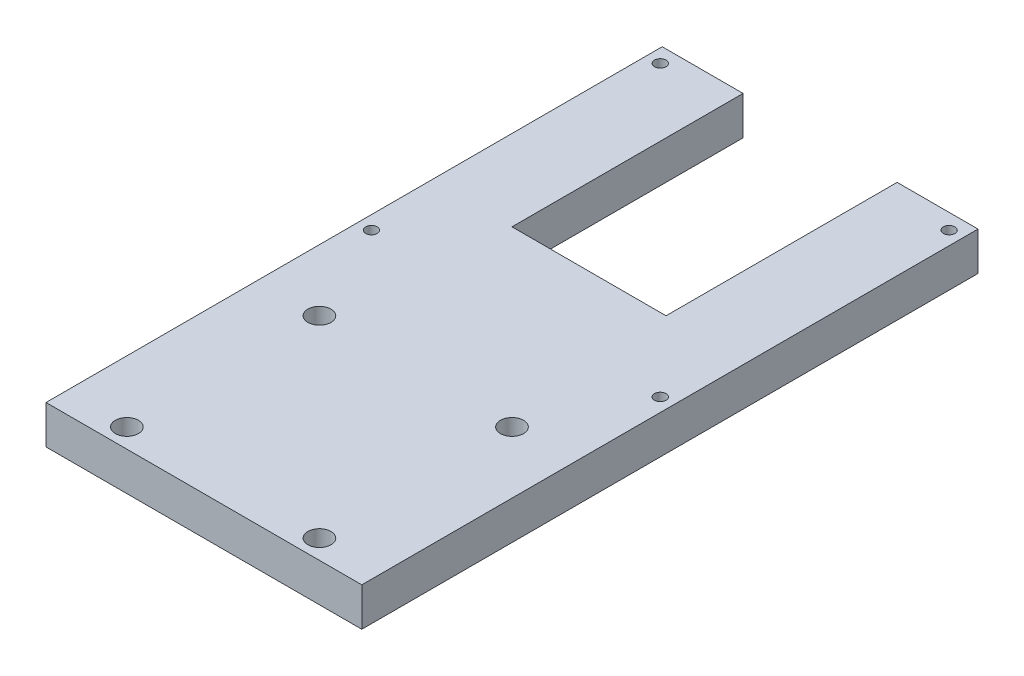
ISO-10303-21;
HEADER;
FILE_DESCRIPTION(('STEP AP214'),'2;1');
FILE_NAME('part.step','',(''),(''),'','','');
FILE_SCHEMA(('AUTOMOTIVE_DESIGN { 1 0 10303 214 1 1 1 1 }'));
ENDSEC;
DATA;
#1=APPLICATION_CONTEXT('core data for automotive mechanical design processes');
#2=APPLICATION_PROTOCOL_DEFINITION('international standard','automotive_design',2000,#1);
#3=PRODUCT_CONTEXT('',#1,'mechanical');
#4=PRODUCT('Part','Part','',(#3));
#5=PRODUCT_RELATED_PRODUCT_CATEGORY('part','',(#4));
#6=PRODUCT_DEFINITION_FORMATION('','',#4);
#7=PRODUCT_DEFINITION_CONTEXT('part definition',#1,'design');
#8=PRODUCT_DEFINITION('design','',#6,#7);
#9=PRODUCT_DEFINITION_SHAPE('','',#8);
#10=(LENGTH_UNIT() NAMED_UNIT(*) SI_UNIT(.MILLI.,.METRE.));
#11=(NAMED_UNIT(*) PLANE_ANGLE_UNIT() SI_UNIT($,.RADIAN.));
#12=(NAMED_UNIT(*) SI_UNIT($,.STERADIAN.) SOLID_ANGLE_UNIT());
#13=UNCERTAINTY_MEASURE_WITH_UNIT(LENGTH_MEASURE(1.E-05),#10,'distance_accuracy_value','');
#14=(GEOMETRIC_REPRESENTATION_CONTEXT(3) GLOBAL_UNCERTAINTY_ASSIGNED_CONTEXT((#13)) GLOBAL_UNIT_ASSIGNED_CONTEXT((#10,
#11,#12)) REPRESENTATION_CONTEXT('',''));
#15=CARTESIAN_POINT('',(0.,0.,0.));
#16=DIRECTION('',(0.,0.,1.));
#17=DIRECTION('',(1.,0.,0.));
#18=AXIS2_PLACEMENT_3D('',#15,#16,#17);
#19=CARTESIAN_POINT('',(0.,10.,0.));
#20=DIRECTION('',(0.,1.,0.));
#21=DIRECTION('',(0.,0.,1.));
#22=AXIS2_PLACEMENT_3D('',#19,#20,#21);
#23=PLANE('',#22);
#24=CARTESIAN_POINT('',(29.4692031234576,10.,-16.2558846313642));
#25=DIRECTION('',(0.,1.,0.));
#26=DIRECTION('',(0.,0.,1.));
#27=AXIS2_PLACEMENT_3D('',#24,#25,#26);
#28=CIRCLE('',#27,1.5);
#29=CARTESIAN_POINT('',(29.4692031234576,10.,-14.7558846313642));
#30=VERTEX_POINT('',#29);
#31=EDGE_CURVE('E253',#30,#30,#28,.T.);
#32=ORIENTED_EDGE('',*,*,#31,.F.);
#33=EDGE_LOOP('',(#32));
#34=FACE_BOUND('',#33,.T.);
#35=CARTESIAN_POINT('',(-45.5307968765432,10.,-91.2558846313642));
#36=DIRECTION('',(0.,1.,0.));
#37=DIRECTION('',(0.,0.,1.));
#38=AXIS2_PLACEMENT_3D('',#35,#36,#37);
#39=CIRCLE('',#38,1.5);
#40=CARTESIAN_POINT('',(-45.5307968765432,10.,-89.7558846313642));
#41=VERTEX_POINT('',#40);
#42=EDGE_CURVE('E237',#41,#41,#39,.T.);
#43=ORIENTED_EDGE('',*,*,#42,.F.);
#44=EDGE_LOOP('',(#43));
#45=FACE_BOUND('',#44,.T.);
#46=CARTESIAN_POINT('',(16.9692031234576,10.,9.7441153686358));
#47=DIRECTION('',(0.,1.,0.));
#48=DIRECTION('',(0.,0.,1.));
#49=AXIS2_PLACEMENT_3D('',#46,#47,#48);
#50=CIRCLE('',#49,3.);
#51=CARTESIAN_POINT('',(16.9692031234576,10.,12.7441153686358));
#52=VERTEX_POINT('',#51);
#53=EDGE_CURVE('E221',#52,#52,#50,.T.);
#54=ORIENTED_EDGE('',*,*,#53,.F.);
#55=EDGE_LOOP('',(#54));
#56=FACE_BOUND('',#55,.T.);
#57=CARTESIAN_POINT('',(-33.0307968765423,10.,59.7441153686358));
#58=DIRECTION('',(0.,1.,0.));
#59=DIRECTION('',(0.,0.,1.));
#60=AXIS2_PLACEMENT_3D('',#57,#58,#59);
#61=CIRCLE('',#60,3.);
#62=CARTESIAN_POINT('',(-33.0307968765423,10.,62.7441153686358));
#63=VERTEX_POINT('',#62);
#64=EDGE_CURVE('E146',#63,#63,#61,.T.);
#65=ORIENTED_EDGE('',*,*,#64,.F.);
#66=EDGE_LOOP('',(#65));
#67=FACE_BOUND('',#66,.T.);
#68=DIRECTION('',(0.,0.,-1.));
#69=VECTOR('',#68,1.);
#70=CARTESIAN_POINT('',(32.9692031234576,10.,64.7441153686358));
#71=LINE('',#70,#69);
#72=CARTESIAN_POINT('',(32.9692031234576,10.,64.7441153686358));
#73=VERTEX_POINT('',#72);
#74=CARTESIAN_POINT('',(32.9692031234576,10.,-95.2558846313642));
#75=VERTEX_POINT('',#74);
#76=EDGE_CURVE('E164',#73,#75,#71,.T.);
#77=ORIENTED_EDGE('',*,*,#76,.T.);
#78=DIRECTION('',(-1.,0.,0.));
#79=VECTOR('',#78,1.);
#80=CARTESIAN_POINT('',(32.9692031234576,10.,-95.2558846313642));
#81=LINE('',#80,#79);
#82=CARTESIAN_POINT('',(11.9692031234576,10.,-95.2558846313642));
#83=VERTEX_POINT('',#82);
#84=EDGE_CURVE('E100',#75,#83,#81,.T.);
#85=ORIENTED_EDGE('',*,*,#84,.T.);
#86=DIRECTION('',(0.,0.,1.));
#87=VECTOR('',#86,1.);
#88=CARTESIAN_POINT('',(11.9692031234576,10.,-95.2558846313642));
#89=LINE('',#88,#87);
#90=CARTESIAN_POINT('',(11.9692031234576,10.,-35.2558846313642));
#91=VERTEX_POINT('',#90);
#92=EDGE_CURVE('E185',#83,#91,#89,.T.);
#93=ORIENTED_EDGE('',*,*,#92,.T.);
#94=DIRECTION('',(-1.,0.,0.));
#95=VECTOR('',#94,1.);
#96=CARTESIAN_POINT('',(-28.0307968765424,10.,-35.2558846313642));
#97=LINE('',#96,#95);
#98=CARTESIAN_POINT('',(-28.0307968765424,10.,-35.2558846313642));
#99=VERTEX_POINT('',#98);
#100=EDGE_CURVE('E199',#91,#99,#97,.T.);
#101=ORIENTED_EDGE('',*,*,#100,.T.);
#102=DIRECTION('',(0.,0.,-1.));
#103=VECTOR('',#102,1.);
#104=CARTESIAN_POINT('',(-28.0307968765424,10.,-95.2558846313642));
#105=LINE('',#104,#103);
#106=CARTESIAN_POINT('',(-28.0307968765424,10.,-95.2558846313642));
#107=VERTEX_POINT('',#106);
#108=EDGE_CURVE('E119',#99,#107,#105,.T.);
#109=ORIENTED_EDGE('',*,*,#108,.T.);
#110=DIRECTION('',(-1.,0.,0.));
#111=VECTOR('',#110,1.);
#112=CARTESIAN_POINT('',(-28.0307968765424,10.,-95.2558846313642));
#113=LINE('',#112,#111);
#114=CARTESIAN_POINT('',(-49.0307968765424,10.,-95.2558846313642));
#115=VERTEX_POINT('',#114);
#116=EDGE_CURVE('E113',#107,#115,#113,.T.);
#117=ORIENTED_EDGE('',*,*,#116,.T.);
#118=DIRECTION('',(0.,0.,1.));
#119=VECTOR('',#118,1.);
#120=CARTESIAN_POINT('',(-49.0307968765424,10.,64.7441153686358));
#121=LINE('',#120,#119);
#122=CARTESIAN_POINT('',(-49.0307968765424,10.,64.7441153686358));
#123=VERTEX_POINT('',#122);
#124=EDGE_CURVE('E117',#115,#123,#121,.T.);
#125=ORIENTED_EDGE('',*,*,#124,.T.);
#126=DIRECTION('',(1.,0.,0.));
#127=VECTOR('',#126,1.);
#128=CARTESIAN_POINT('',(32.9692031234576,10.,64.7441153686358));
#129=LINE('',#128,#127);
#130=EDGE_CURVE('E57',#123,#73,#129,.T.);
#131=ORIENTED_EDGE('',*,*,#130,.T.);
#132=EDGE_LOOP('',(#77,#85,#93,#101,#109,#117,#125,#131));
#133=FACE_BOUND('',#132,.T.);
#134=CARTESIAN_POINT('',(16.9692031234577,10.,59.7441153686358));
#135=DIRECTION('',(0.,1.,0.));
#136=DIRECTION('',(0.,0.,1.));
#137=AXIS2_PLACEMENT_3D('',#134,#135,#136);
#138=CIRCLE('',#137,3.);
#139=CARTESIAN_POINT('',(16.9692031234577,10.,62.7441153686358));
#140=VERTEX_POINT('',#139);
#141=EDGE_CURVE('E213',#140,#140,#138,.T.);
#142=ORIENTED_EDGE('',*,*,#141,.F.);
#143=EDGE_LOOP('',(#142));
#144=FACE_BOUND('',#143,.T.);
#145=CARTESIAN_POINT('',(-33.0307968765424,10.,9.7441153686358));
#146=DIRECTION('',(0.,1.,0.));
#147=DIRECTION('',(0.,0.,1.));
#148=AXIS2_PLACEMENT_3D('',#145,#146,#147);
#149=CIRCLE('',#148,3.);
#150=CARTESIAN_POINT('',(-33.0307968765424,10.,12.7441153686358));
#151=VERTEX_POINT('',#150);
#152=EDGE_CURVE('E229',#151,#151,#149,.T.);
#153=ORIENTED_EDGE('',*,*,#152,.F.);
#154=EDGE_LOOP('',(#153));
#155=FACE_BOUND('',#154,.T.);
#156=CARTESIAN_POINT('',(29.4692031234568,10.,-91.2558846313642));
#157=DIRECTION('',(0.,1.,0.));
#158=DIRECTION('',(0.,0.,1.));
#159=AXIS2_PLACEMENT_3D('',#156,#157,#158);
#160=CIRCLE('',#159,1.5);
#161=CARTESIAN_POINT('',(29.4692031234568,10.,-89.7558846313642));
#162=VERTEX_POINT('',#161);
#163=EDGE_CURVE('E245',#162,#162,#160,.T.);
#164=ORIENTED_EDGE('',*,*,#163,.F.);
#165=EDGE_LOOP('',(#164));
#166=FACE_BOUND('',#165,.T.);
#167=CARTESIAN_POINT('',(-45.5307968765424,10.,-16.2558846313642));
#168=DIRECTION('',(0.,1.,0.));
#169=DIRECTION('',(0.,0.,1.));
#170=AXIS2_PLACEMENT_3D('',#167,#168,#169);
#171=CIRCLE('',#170,1.5);
#172=CARTESIAN_POINT('',(-45.5307968765424,10.,-14.7558846313642));
#173=VERTEX_POINT('',#172);
#174=EDGE_CURVE('E261',#173,#173,#171,.T.);
#175=ORIENTED_EDGE('',*,*,#174,.F.);
#176=EDGE_LOOP('',(#175));
#177=FACE_BOUND('',#176,.T.);
#178=ADVANCED_FACE('F39',(#34,#45,#56,#67,#133,#144,#155,#166,#177),#23,.T.);
#179=CARTESIAN_POINT('',(0.,0.,0.));
#180=DIRECTION('',(0.,1.,0.));
#181=DIRECTION('',(0.,0.,1.));
#182=AXIS2_PLACEMENT_3D('',#179,#180,#181);
#183=PLANE('',#182);
#184=DIRECTION('',(0.,0.,-1.));
#185=VECTOR('',#184,1.);
#186=CARTESIAN_POINT('',(32.9692031234576,0.,64.7441153686358));
#187=LINE('',#186,#185);
#188=CARTESIAN_POINT('',(32.9692031234576,0.,64.7441153686358));
#189=VERTEX_POINT('',#188);
#190=CARTESIAN_POINT('',(32.9692031234576,0.,-95.2558846313642));
#191=VERTEX_POINT('',#190);
#192=EDGE_CURVE('E141',#189,#191,#187,.T.);
#193=ORIENTED_EDGE('',*,*,#192,.F.);
#194=DIRECTION('',(1.,0.,0.));
#195=VECTOR('',#194,1.);
#196=CARTESIAN_POINT('',(32.9692031234576,0.,64.7441153686358));
#197=LINE('',#196,#195);
#198=CARTESIAN_POINT('',(-49.0307968765424,0.,64.7441153686358));
#199=VERTEX_POINT('',#198);
#200=EDGE_CURVE('E92',#199,#189,#197,.T.);
#201=ORIENTED_EDGE('',*,*,#200,.F.);
#202=DIRECTION('',(0.,0.,1.));
#203=VECTOR('',#202,1.);
#204=CARTESIAN_POINT('',(-49.0307968765424,0.,64.7441153686358));
#205=LINE('',#204,#203);
#206=CARTESIAN_POINT('',(-49.0307968765424,0.,-95.2558846313642));
#207=VERTEX_POINT('',#206);
#208=EDGE_CURVE('E86',#207,#199,#205,.T.);
#209=ORIENTED_EDGE('',*,*,#208,.F.);
#210=DIRECTION('',(-1.,0.,0.));
#211=VECTOR('',#210,1.);
#212=CARTESIAN_POINT('',(-28.0307968765424,0.,-95.2558846313642));
#213=LINE('',#212,#211);
#214=CARTESIAN_POINT('',(-28.0307968765424,0.,-95.2558846313642));
#215=VERTEX_POINT('',#214);
#216=EDGE_CURVE('E128',#215,#207,#213,.T.);
#217=ORIENTED_EDGE('',*,*,#216,.F.);
#218=DIRECTION('',(0.,0.,-1.));
#219=VECTOR('',#218,1.);
#220=CARTESIAN_POINT('',(-28.0307968765424,0.,-95.2558846313642));
#221=LINE('',#220,#219);
#222=CARTESIAN_POINT('',(-28.0307968765424,0.,-35.2558846313642));
#223=VERTEX_POINT('',#222);
#224=EDGE_CURVE('E155',#223,#215,#221,.T.);
#225=ORIENTED_EDGE('',*,*,#224,.F.);
#226=DIRECTION('',(-1.,0.,0.));
#227=VECTOR('',#226,1.);
#228=CARTESIAN_POINT('',(-28.0307968765424,0.,-35.2558846313642));
#229=LINE('',#228,#227);
#230=CARTESIAN_POINT('',(11.9692031234576,0.,-35.2558846313642));
#231=VERTEX_POINT('',#230);
#232=EDGE_CURVE('E152',#231,#223,#229,.T.);
#233=ORIENTED_EDGE('',*,*,#232,.F.);
#234=DIRECTION('',(0.,0.,1.));
#235=VECTOR('',#234,1.);
#236=CARTESIAN_POINT('',(11.9692031234576,0.,-95.2558846313642));
#237=LINE('',#236,#235);
#238=CARTESIAN_POINT('',(11.9692031234576,0.,-95.2558846313642));
#239=VERTEX_POINT('',#238);
#240=EDGE_CURVE('E149',#239,#231,#237,.T.);
#241=ORIENTED_EDGE('',*,*,#240,.F.);
#242=DIRECTION('',(-1.,0.,0.));
#243=VECTOR('',#242,1.);
#244=CARTESIAN_POINT('',(32.9692031234576,0.,-95.2558846313642));
#245=LINE('',#244,#243);
#246=EDGE_CURVE('E145',#191,#239,#245,.T.);
#247=ORIENTED_EDGE('',*,*,#246,.F.);
#248=EDGE_LOOP('',(#193,#201,#209,#217,#225,#233,#241,#247));
#249=FACE_BOUND('',#248,.T.);
#250=CARTESIAN_POINT('',(-33.0307968765423,0.,59.7441153686358));
#251=DIRECTION('',(0.,1.,0.));
#252=DIRECTION('',(0.,0.,1.));
#253=AXIS2_PLACEMENT_3D('',#250,#251,#252);
#254=CIRCLE('',#253,3.);
#255=CARTESIAN_POINT('',(-33.0307968765423,0.,62.7441153686358));
#256=VERTEX_POINT('',#255);
#257=EDGE_CURVE('E209',#256,#256,#254,.T.);
#258=ORIENTED_EDGE('',*,*,#257,.T.);
#259=EDGE_LOOP('',(#258));
#260=FACE_BOUND('',#259,.T.);
#261=CARTESIAN_POINT('',(16.9692031234577,0.,59.7441153686358));
#262=DIRECTION('',(0.,1.,0.));
#263=DIRECTION('',(0.,0.,1.));
#264=AXIS2_PLACEMENT_3D('',#261,#262,#263);
#265=CIRCLE('',#264,3.);
#266=CARTESIAN_POINT('',(16.9692031234577,0.,62.7441153686358));
#267=VERTEX_POINT('',#266);
#268=EDGE_CURVE('E217',#267,#267,#265,.T.);
#269=ORIENTED_EDGE('',*,*,#268,.T.);
#270=EDGE_LOOP('',(#269));
#271=FACE_BOUND('',#270,.T.);
#272=CARTESIAN_POINT('',(16.9692031234576,0.,9.7441153686358));
#273=DIRECTION('',(0.,1.,0.));
#274=DIRECTION('',(0.,0.,1.));
#275=AXIS2_PLACEMENT_3D('',#272,#273,#274);
#276=CIRCLE('',#275,3.);
#277=CARTESIAN_POINT('',(16.9692031234576,0.,12.7441153686358));
#278=VERTEX_POINT('',#277);
#279=EDGE_CURVE('E225',#278,#278,#276,.T.);
#280=ORIENTED_EDGE('',*,*,#279,.T.);
#281=EDGE_LOOP('',(#280));
#282=FACE_BOUND('',#281,.T.);
#283=CARTESIAN_POINT('',(-33.0307968765424,0.,9.7441153686358));
#284=DIRECTION('',(0.,1.,0.));
#285=DIRECTION('',(0.,0.,1.));
#286=AXIS2_PLACEMENT_3D('',#283,#284,#285);
#287=CIRCLE('',#286,3.);
#288=CARTESIAN_POINT('',(-33.0307968765424,0.,12.7441153686358));
#289=VERTEX_POINT('',#288);
#290=EDGE_CURVE('E233',#289,#289,#287,.T.);
#291=ORIENTED_EDGE('',*,*,#290,.T.);
#292=EDGE_LOOP('',(#291));
#293=FACE_BOUND('',#292,.T.);
#294=CARTESIAN_POINT('',(-45.5307968765432,0.,-91.2558846313642));
#295=DIRECTION('',(0.,1.,0.));
#296=DIRECTION('',(0.,0.,1.));
#297=AXIS2_PLACEMENT_3D('',#294,#295,#296);
#298=CIRCLE('',#297,1.5);
#299=CARTESIAN_POINT('',(-45.5307968765432,0.,-89.7558846313642));
#300=VERTEX_POINT('',#299);
#301=EDGE_CURVE('E241',#300,#300,#298,.T.);
#302=ORIENTED_EDGE('',*,*,#301,.T.);
#303=EDGE_LOOP('',(#302));
#304=FACE_BOUND('',#303,.T.);
#305=CARTESIAN_POINT('',(29.4692031234568,0.,-91.2558846313642));
#306=DIRECTION('',(0.,1.,0.));
#307=DIRECTION('',(0.,0.,1.));
#308=AXIS2_PLACEMENT_3D('',#305,#306,#307);
#309=CIRCLE('',#308,1.5);
#310=CARTESIAN_POINT('',(29.4692031234568,0.,-89.7558846313642));
#311=VERTEX_POINT('',#310);
#312=EDGE_CURVE('E249',#311,#311,#309,.T.);
#313=ORIENTED_EDGE('',*,*,#312,.T.);
#314=EDGE_LOOP('',(#313));
#315=FACE_BOUND('',#314,.T.);
#316=CARTESIAN_POINT('',(29.4692031234576,0.,-16.2558846313642));
#317=DIRECTION('',(0.,1.,0.));
#318=DIRECTION('',(0.,0.,1.));
#319=AXIS2_PLACEMENT_3D('',#316,#317,#318);
#320=CIRCLE('',#319,1.5);
#321=CARTESIAN_POINT('',(29.4692031234576,0.,-14.7558846313642));
#322=VERTEX_POINT('',#321);
#323=EDGE_CURVE('E257',#322,#322,#320,.T.);
#324=ORIENTED_EDGE('',*,*,#323,.T.);
#325=EDGE_LOOP('',(#324));
#326=FACE_BOUND('',#325,.T.);
#327=CARTESIAN_POINT('',(-45.5307968765424,0.,-16.2558846313642));
#328=DIRECTION('',(0.,1.,0.));
#329=DIRECTION('',(0.,0.,1.));
#330=AXIS2_PLACEMENT_3D('',#327,#328,#329);
#331=CIRCLE('',#330,1.5);
#332=CARTESIAN_POINT('',(-45.5307968765424,0.,-14.7558846313642));
#333=VERTEX_POINT('',#332);
#334=EDGE_CURVE('E265',#333,#333,#331,.T.);
#335=ORIENTED_EDGE('',*,*,#334,.T.);
#336=EDGE_LOOP('',(#335));
#337=FACE_BOUND('',#336,.T.);
#338=ADVANCED_FACE('F189',(#249,#260,#271,#282,#293,#304,#315,#326,#337),#183,.F.);
#339=CARTESIAN_POINT('',(32.9692031234576,10.,64.7441153686358));
#340=DIRECTION('',(-1.,0.,0.));
#341=DIRECTION('',(0.,0.,1.));
#342=AXIS2_PLACEMENT_3D('',#339,#340,#341);
#343=PLANE('',#342);
#344=ORIENTED_EDGE('',*,*,#192,.T.);
#345=DIRECTION('',(0.,-1.,0.));
#346=VECTOR('',#345,1.);
#347=CARTESIAN_POINT('',(32.9692031234576,10.,-95.2558846313642));
#348=LINE('',#347,#346);
#349=EDGE_CURVE('E11',#75,#191,#348,.T.);
#350=ORIENTED_EDGE('',*,*,#349,.F.);
#351=ORIENTED_EDGE('',*,*,#76,.F.);
#352=DIRECTION('',(0.,-1.,0.));
#353=VECTOR('',#352,1.);
#354=CARTESIAN_POINT('',(32.9692031234576,10.,64.7441153686358));
#355=LINE('',#354,#353);
#356=EDGE_CURVE('E137',#73,#189,#355,.T.);
#357=ORIENTED_EDGE('',*,*,#356,.T.);
#358=EDGE_LOOP('',(#344,#350,#351,#357));
#359=FACE_BOUND('',#358,.T.);
#360=ADVANCED_FACE('F41',(#359),#343,.F.);
#361=CARTESIAN_POINT('',(32.9692031234576,10.,-95.2558846313642));
#362=DIRECTION('',(0.,0.,1.));
#363=DIRECTION('',(1.,0.,0.));
#364=AXIS2_PLACEMENT_3D('',#361,#362,#363);
#365=PLANE('',#364);
#366=ORIENTED_EDGE('',*,*,#246,.T.);
#367=DIRECTION('',(0.,-1.,0.));
#368=VECTOR('',#367,1.);
#369=CARTESIAN_POINT('',(11.9692031234576,10.,-95.2558846313642));
#370=LINE('',#369,#368);
#371=EDGE_CURVE('E49',#83,#239,#370,.T.);
#372=ORIENTED_EDGE('',*,*,#371,.F.);
#373=ORIENTED_EDGE('',*,*,#84,.F.);
#374=ORIENTED_EDGE('',*,*,#349,.T.);
#375=EDGE_LOOP('',(#366,#372,#373,#374));
#376=FACE_BOUND('',#375,.T.);
#377=ADVANCED_FACE('F301',(#376),#365,.F.);
#378=CARTESIAN_POINT('',(11.9692031234576,10.,-95.2558846313642));
#379=DIRECTION('',(1.,0.,0.));
#380=DIRECTION('',(0.,0.,-1.));
#381=AXIS2_PLACEMENT_3D('',#378,#379,#380);
#382=PLANE('',#381);
#383=ORIENTED_EDGE('',*,*,#240,.T.);
#384=DIRECTION('',(0.,-1.,0.));
#385=VECTOR('',#384,1.);
#386=CARTESIAN_POINT('',(11.9692031234576,10.,-35.2558846313642));
#387=LINE('',#386,#385);
#388=EDGE_CURVE('E175',#91,#231,#387,.T.);
#389=ORIENTED_EDGE('',*,*,#388,.F.);
#390=ORIENTED_EDGE('',*,*,#92,.F.);
#391=ORIENTED_EDGE('',*,*,#371,.T.);
#392=EDGE_LOOP('',(#383,#389,#390,#391));
#393=FACE_BOUND('',#392,.T.);
#394=ADVANCED_FACE('F183',(#393),#382,.F.);
#395=CARTESIAN_POINT('',(-28.0307968765424,10.,-35.2558846313642));
#396=DIRECTION('',(0.,0.,1.));
#397=DIRECTION('',(1.,0.,0.));
#398=AXIS2_PLACEMENT_3D('',#395,#396,#397);
#399=PLANE('',#398);
#400=ORIENTED_EDGE('',*,*,#232,.T.);
#401=DIRECTION('',(0.,-1.,0.));
#402=VECTOR('',#401,1.);
#403=CARTESIAN_POINT('',(-28.0307968765424,10.,-35.2558846313642));
#404=LINE('',#403,#402);
#405=EDGE_CURVE('E171',#99,#223,#404,.T.);
#406=ORIENTED_EDGE('',*,*,#405,.F.);
#407=ORIENTED_EDGE('',*,*,#100,.F.);
#408=ORIENTED_EDGE('',*,*,#388,.T.);
#409=EDGE_LOOP('',(#400,#406,#407,#408));
#410=FACE_BOUND('',#409,.T.);
#411=ADVANCED_FACE('F194',(#410),#399,.F.);
#412=CARTESIAN_POINT('',(-28.0307968765424,10.,-95.2558846313642));
#413=DIRECTION('',(-1.,0.,0.));
#414=DIRECTION('',(0.,0.,1.));
#415=AXIS2_PLACEMENT_3D('',#412,#413,#414);
#416=PLANE('',#415);
#417=ORIENTED_EDGE('',*,*,#224,.T.);
#418=DIRECTION('',(0.,-1.,0.));
#419=VECTOR('',#418,1.);
#420=CARTESIAN_POINT('',(-28.0307968765424,10.,-95.2558846313642));
#421=LINE('',#420,#419);
#422=EDGE_CURVE('E130',#107,#215,#421,.T.);
#423=ORIENTED_EDGE('',*,*,#422,.F.);
#424=ORIENTED_EDGE('',*,*,#108,.F.);
#425=ORIENTED_EDGE('',*,*,#405,.T.);
#426=EDGE_LOOP('',(#417,#423,#424,#425));
#427=FACE_BOUND('',#426,.T.);
#428=ADVANCED_FACE('F197',(#427),#416,.F.);
#429=CARTESIAN_POINT('',(-28.0307968765424,10.,-95.2558846313642));
#430=DIRECTION('',(0.,0.,1.));
#431=DIRECTION('',(1.,0.,0.));
#432=AXIS2_PLACEMENT_3D('',#429,#430,#431);
#433=PLANE('',#432);
#434=ORIENTED_EDGE('',*,*,#216,.T.);
#435=DIRECTION('',(0.,-1.,0.));
#436=VECTOR('',#435,1.);
#437=CARTESIAN_POINT('',(-49.0307968765424,10.,-95.2558846313642));
#438=LINE('',#437,#436);
#439=EDGE_CURVE('E125',#115,#207,#438,.T.);
#440=ORIENTED_EDGE('',*,*,#439,.F.);
#441=ORIENTED_EDGE('',*,*,#116,.F.);
#442=ORIENTED_EDGE('',*,*,#422,.T.);
#443=EDGE_LOOP('',(#434,#440,#441,#442));
#444=FACE_BOUND('',#443,.T.);
#445=ADVANCED_FACE('F126',(#444),#433,.F.);
#446=CARTESIAN_POINT('',(-49.0307968765424,10.,64.7441153686358));
#447=DIRECTION('',(1.,0.,0.));
#448=DIRECTION('',(0.,0.,-1.));
#449=AXIS2_PLACEMENT_3D('',#446,#447,#448);
#450=PLANE('',#449);
#451=ORIENTED_EDGE('',*,*,#208,.T.);
#452=DIRECTION('',(0.,-1.,0.));
#453=VECTOR('',#452,1.);
#454=CARTESIAN_POINT('',(-49.0307968765424,10.,64.7441153686358));
#455=LINE('',#454,#453);
#456=EDGE_CURVE('E131',#123,#199,#455,.T.);
#457=ORIENTED_EDGE('',*,*,#456,.F.);
#458=ORIENTED_EDGE('',*,*,#124,.F.);
#459=ORIENTED_EDGE('',*,*,#439,.T.);
#460=EDGE_LOOP('',(#451,#457,#458,#459));
#461=FACE_BOUND('',#460,.T.);
#462=ADVANCED_FACE('F133',(#461),#450,.F.);
#463=CARTESIAN_POINT('',(32.9692031234576,10.,64.7441153686358));
#464=DIRECTION('',(0.,0.,-1.));
#465=DIRECTION('',(-1.,0.,0.));
#466=AXIS2_PLACEMENT_3D('',#463,#464,#465);
#467=PLANE('',#466);
#468=ORIENTED_EDGE('',*,*,#200,.T.);
#469=ORIENTED_EDGE('',*,*,#356,.F.);
#470=ORIENTED_EDGE('',*,*,#130,.F.);
#471=ORIENTED_EDGE('',*,*,#456,.T.);
#472=EDGE_LOOP('',(#468,#469,#470,#471));
#473=FACE_BOUND('',#472,.T.);
#474=ADVANCED_FACE('F289',(#473),#467,.F.);
#475=CARTESIAN_POINT('',(-33.0307968765423,10.,59.7441153686358));
#476=DIRECTION('',(0.,-1.,0.));
#477=DIRECTION('',(0.,0.,-1.));
#478=AXIS2_PLACEMENT_3D('',#475,#476,#477);
#479=CYLINDRICAL_SURFACE('',#478,3.);
#480=ORIENTED_EDGE('',*,*,#64,.T.);
#481=EDGE_LOOP('',(#480));
#482=FACE_BOUND('',#481,.T.);
#483=ORIENTED_EDGE('',*,*,#257,.F.);
#484=EDGE_LOOP('',(#483));
#485=FACE_BOUND('',#484,.T.);
#486=ADVANCED_FACE('F286',(#482,#485),#479,.F.);
#487=CARTESIAN_POINT('',(16.9692031234577,10.,59.7441153686358));
#488=DIRECTION('',(0.,-1.,0.));
#489=DIRECTION('',(0.,0.,-1.));
#490=AXIS2_PLACEMENT_3D('',#487,#488,#489);
#491=CYLINDRICAL_SURFACE('',#490,3.);
#492=ORIENTED_EDGE('',*,*,#141,.T.);
#493=EDGE_LOOP('',(#492));
#494=FACE_BOUND('',#493,.T.);
#495=ORIENTED_EDGE('',*,*,#268,.F.);
#496=EDGE_LOOP('',(#495));
#497=FACE_BOUND('',#496,.T.);
#498=ADVANCED_FACE('F365',(#494,#497),#491,.F.);
#499=CARTESIAN_POINT('',(16.9692031234576,10.,9.7441153686358));
#500=DIRECTION('',(0.,-1.,0.));
#501=DIRECTION('',(0.,0.,-1.));
#502=AXIS2_PLACEMENT_3D('',#499,#500,#501);
#503=CYLINDRICAL_SURFACE('',#502,3.);
#504=ORIENTED_EDGE('',*,*,#53,.T.);
#505=EDGE_LOOP('',(#504));
#506=FACE_BOUND('',#505,.T.);
#507=ORIENTED_EDGE('',*,*,#279,.F.);
#508=EDGE_LOOP('',(#507));
#509=FACE_BOUND('',#508,.T.);
#510=ADVANCED_FACE('F373',(#506,#509),#503,.F.);
#511=CARTESIAN_POINT('',(-33.0307968765424,10.,9.7441153686358));
#512=DIRECTION('',(0.,-1.,0.));
#513=DIRECTION('',(0.,0.,-1.));
#514=AXIS2_PLACEMENT_3D('',#511,#512,#513);
#515=CYLINDRICAL_SURFACE('',#514,3.);
#516=ORIENTED_EDGE('',*,*,#152,.T.);
#517=EDGE_LOOP('',(#516));
#518=FACE_BOUND('',#517,.T.);
#519=ORIENTED_EDGE('',*,*,#290,.F.);
#520=EDGE_LOOP('',(#519));
#521=FACE_BOUND('',#520,.T.);
#522=ADVANCED_FACE('F381',(#518,#521),#515,.F.);
#523=CARTESIAN_POINT('',(-45.5307968765432,10.,-91.2558846313642));
#524=DIRECTION('',(0.,-1.,0.));
#525=DIRECTION('',(0.,0.,-1.));
#526=AXIS2_PLACEMENT_3D('',#523,#524,#525);
#527=CYLINDRICAL_SURFACE('',#526,1.5);
#528=ORIENTED_EDGE('',*,*,#42,.T.);
#529=EDGE_LOOP('',(#528));
#530=FACE_BOUND('',#529,.T.);
#531=ORIENTED_EDGE('',*,*,#301,.F.);
#532=EDGE_LOOP('',(#531));
#533=FACE_BOUND('',#532,.T.);
#534=ADVANCED_FACE('F390',(#530,#533),#527,.F.);
#535=CARTESIAN_POINT('',(29.4692031234568,10.,-91.2558846313642));
#536=DIRECTION('',(0.,-1.,0.));
#537=DIRECTION('',(0.,0.,-1.));
#538=AXIS2_PLACEMENT_3D('',#535,#536,#537);
#539=CYLINDRICAL_SURFACE('',#538,1.5);
#540=ORIENTED_EDGE('',*,*,#163,.T.);
#541=EDGE_LOOP('',(#540));
#542=FACE_BOUND('',#541,.T.);
#543=ORIENTED_EDGE('',*,*,#312,.F.);
#544=EDGE_LOOP('',(#543));
#545=FACE_BOUND('',#544,.T.);
#546=ADVANCED_FACE('F399',(#542,#545),#539,.F.);
#547=CARTESIAN_POINT('',(29.4692031234576,10.,-16.2558846313642));
#548=DIRECTION('',(0.,-1.,0.));
#549=DIRECTION('',(0.,0.,-1.));
#550=AXIS2_PLACEMENT_3D('',#547,#548,#549);
#551=CYLINDRICAL_SURFACE('',#550,1.5);
#552=ORIENTED_EDGE('',*,*,#31,.T.);
#553=EDGE_LOOP('',(#552));
#554=FACE_BOUND('',#553,.T.);
#555=ORIENTED_EDGE('',*,*,#323,.F.);
#556=EDGE_LOOP('',(#555));
#557=FACE_BOUND('',#556,.T.);
#558=ADVANCED_FACE('F408',(#554,#557),#551,.F.);
#559=CARTESIAN_POINT('',(-45.5307968765424,10.,-16.2558846313642));
#560=DIRECTION('',(0.,-1.,0.));
#561=DIRECTION('',(0.,0.,-1.));
#562=AXIS2_PLACEMENT_3D('',#559,#560,#561);
#563=CYLINDRICAL_SURFACE('',#562,1.5);
#564=ORIENTED_EDGE('',*,*,#174,.T.);
#565=EDGE_LOOP('',(#564));
#566=FACE_BOUND('',#565,.T.);
#567=ORIENTED_EDGE('',*,*,#334,.F.);
#568=EDGE_LOOP('',(#567));
#569=FACE_BOUND('',#568,.T.);
#570=ADVANCED_FACE('F273',(#566,#569),#563,.F.);
#571=CLOSED_SHELL('',(#178,#338,#360,#377,#394,#411,#428,#445,#462,#474,#486,#498,#510,#522,
#534,#546,#558,#570));
#572=MANIFOLD_SOLID_BREP('B2',#571);
#573=ADVANCED_BREP_SHAPE_REPRESENTATION('',(#18,#572),#14);
#574=SHAPE_DEFINITION_REPRESENTATION(#9,#573);
ENDSEC;
END-ISO-10303-21;
